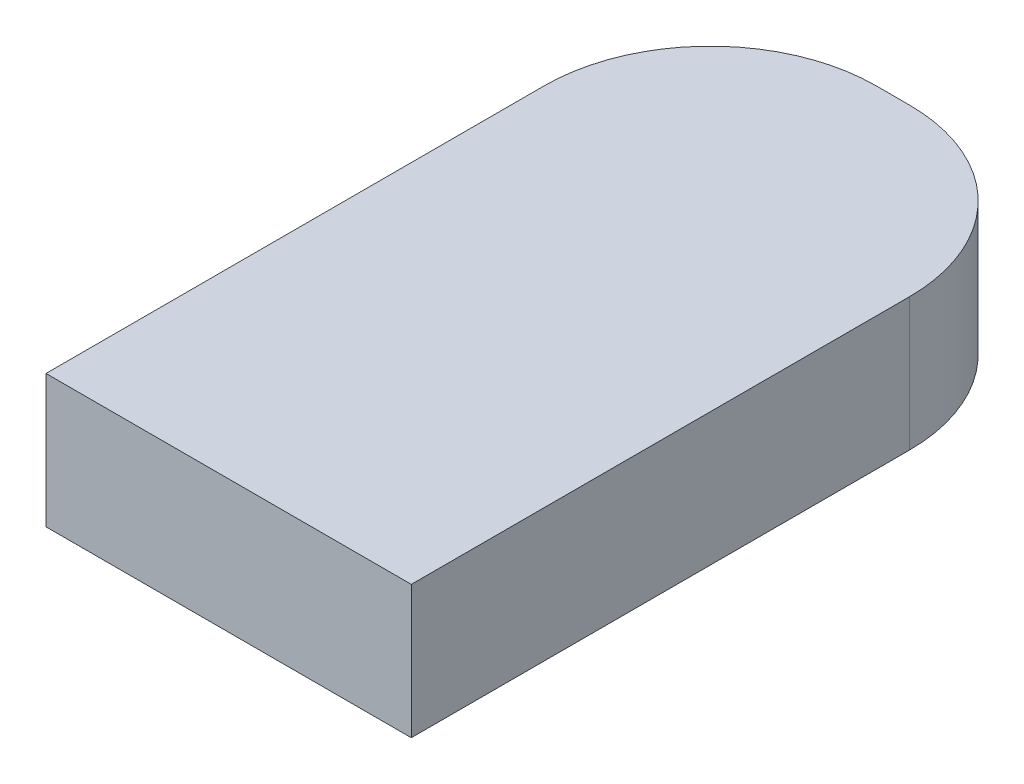
ISO-10303-21;
HEADER;
FILE_DESCRIPTION(('STEP AP214'),'2;1');
FILE_NAME('part.step','',(''),(''),'','','');
FILE_SCHEMA(('AUTOMOTIVE_DESIGN { 1 0 10303 214 1 1 1 1 }'));
ENDSEC;
DATA;
#1=APPLICATION_CONTEXT('core data for automotive mechanical design processes');
#2=APPLICATION_PROTOCOL_DEFINITION('international standard','automotive_design',2000,#1);
#3=PRODUCT_CONTEXT('',#1,'mechanical');
#4=PRODUCT('Part','Part','',(#3));
#5=PRODUCT_RELATED_PRODUCT_CATEGORY('part','',(#4));
#6=PRODUCT_DEFINITION_FORMATION('','',#4);
#7=PRODUCT_DEFINITION_CONTEXT('part definition',#1,'design');
#8=PRODUCT_DEFINITION('design','',#6,#7);
#9=PRODUCT_DEFINITION_SHAPE('','',#8);
#10=(LENGTH_UNIT() NAMED_UNIT(*) SI_UNIT(.MILLI.,.METRE.));
#11=(NAMED_UNIT(*) PLANE_ANGLE_UNIT() SI_UNIT($,.RADIAN.));
#12=(NAMED_UNIT(*) SI_UNIT($,.STERADIAN.) SOLID_ANGLE_UNIT());
#13=UNCERTAINTY_MEASURE_WITH_UNIT(LENGTH_MEASURE(1.E-05),#10,'distance_accuracy_value','');
#14=(GEOMETRIC_REPRESENTATION_CONTEXT(3) GLOBAL_UNCERTAINTY_ASSIGNED_CONTEXT((#13)) GLOBAL_UNIT_ASSIGNED_CONTEXT((#10,
#11,#12)) REPRESENTATION_CONTEXT('',''));
#15=CARTESIAN_POINT('',(0.,0.,0.));
#16=DIRECTION('',(0.,0.,1.));
#17=DIRECTION('',(1.,0.,0.));
#18=AXIS2_PLACEMENT_3D('',#15,#16,#17);
#19=CARTESIAN_POINT('',(0.,8.,0.));
#20=DIRECTION('',(1.,0.,0.));
#21=DIRECTION('',(0.,0.,-1.));
#22=AXIS2_PLACEMENT_3D('',#19,#20,#21);
#23=PLANE('',#22);
#24=DIRECTION('',(0.,0.,1.));
#25=VECTOR('',#24,1.);
#26=CARTESIAN_POINT('',(0.,0.,0.));
#27=LINE('',#26,#25);
#28=CARTESIAN_POINT('',(0.,0.,-29.9999999999999));
#29=VERTEX_POINT('',#28);
#30=CARTESIAN_POINT('',(0.,0.,0.));
#31=VERTEX_POINT('',#30);
#32=EDGE_CURVE('E117',#29,#31,#27,.T.);
#33=ORIENTED_EDGE('',*,*,#32,.T.);
#34=DIRECTION('',(0.,-1.,0.));
#35=VECTOR('',#34,1.);
#36=CARTESIAN_POINT('',(0.,8.,0.));
#37=LINE('',#36,#35);
#38=CARTESIAN_POINT('',(0.,8.,0.));
#39=VERTEX_POINT('',#38);
#40=EDGE_CURVE('E11',#39,#31,#37,.T.);
#41=ORIENTED_EDGE('',*,*,#40,.F.);
#42=DIRECTION('',(0.,0.,1.));
#43=VECTOR('',#42,1.);
#44=CARTESIAN_POINT('',(0.,8.,0.));
#45=LINE('',#44,#43);
#46=CARTESIAN_POINT('',(0.,8.,-29.9999999999999));
#47=VERTEX_POINT('',#46);
#48=EDGE_CURVE('E127',#47,#39,#45,.T.);
#49=ORIENTED_EDGE('',*,*,#48,.F.);
#50=DIRECTION('',(0.,-1.,0.));
#51=VECTOR('',#50,1.);
#52=CARTESIAN_POINT('',(0.,8.,-29.9999999999999));
#53=LINE('',#52,#51);
#54=EDGE_CURVE('E113',#47,#29,#53,.T.);
#55=ORIENTED_EDGE('',*,*,#54,.T.);
#56=EDGE_LOOP('',(#33,#41,#49,#55));
#57=FACE_BOUND('',#56,.T.);
#58=ADVANCED_FACE('F33',(#57),#23,.F.);
#59=CARTESIAN_POINT('',(0.,8.,0.));
#60=DIRECTION('',(0.,0.,-1.));
#61=DIRECTION('',(-1.,0.,0.));
#62=AXIS2_PLACEMENT_3D('',#59,#60,#61);
#63=PLANE('',#62);
#64=DIRECTION('',(1.,0.,0.));
#65=VECTOR('',#64,1.);
#66=CARTESIAN_POINT('',(0.,0.,0.));
#67=LINE('',#66,#65);
#68=CARTESIAN_POINT('',(22.,0.,0.));
#69=VERTEX_POINT('',#68);
#70=EDGE_CURVE('E120',#31,#69,#67,.T.);
#71=ORIENTED_EDGE('',*,*,#70,.T.);
#72=DIRECTION('',(0.,-1.,0.));
#73=VECTOR('',#72,1.);
#74=CARTESIAN_POINT('',(22.,8.,0.));
#75=LINE('',#74,#73);
#76=CARTESIAN_POINT('',(22.,8.,0.));
#77=VERTEX_POINT('',#76);
#78=EDGE_CURVE('E41',#77,#69,#75,.T.);
#79=ORIENTED_EDGE('',*,*,#78,.F.);
#80=DIRECTION('',(1.,0.,0.));
#81=VECTOR('',#80,1.);
#82=CARTESIAN_POINT('',(0.,8.,0.));
#83=LINE('',#82,#81);
#84=EDGE_CURVE('E86',#39,#77,#83,.T.);
#85=ORIENTED_EDGE('',*,*,#84,.F.);
#86=ORIENTED_EDGE('',*,*,#40,.T.);
#87=EDGE_LOOP('',(#71,#79,#85,#86));
#88=FACE_BOUND('',#87,.T.);
#89=ADVANCED_FACE('F151',(#88),#63,.F.);
#90=CARTESIAN_POINT('',(22.,8.,0.));
#91=DIRECTION('',(-1.,0.,0.));
#92=DIRECTION('',(0.,0.,1.));
#93=AXIS2_PLACEMENT_3D('',#90,#91,#92);
#94=PLANE('',#93);
#95=DIRECTION('',(0.,0.,-1.));
#96=VECTOR('',#95,1.);
#97=CARTESIAN_POINT('',(22.,0.,0.));
#98=LINE('',#97,#96);
#99=CARTESIAN_POINT('',(22.,0.,-29.9999999999999));
#100=VERTEX_POINT('',#99);
#101=EDGE_CURVE('E122',#69,#100,#98,.T.);
#102=ORIENTED_EDGE('',*,*,#101,.T.);
#103=DIRECTION('',(0.,-1.,0.));
#104=VECTOR('',#103,1.);
#105=CARTESIAN_POINT('',(22.,8.,-29.9999999999999));
#106=LINE('',#105,#104);
#107=CARTESIAN_POINT('',(22.,8.,-29.9999999999999));
#108=VERTEX_POINT('',#107);
#109=EDGE_CURVE('E108',#108,#100,#106,.T.);
#110=ORIENTED_EDGE('',*,*,#109,.F.);
#111=DIRECTION('',(0.,0.,-1.));
#112=VECTOR('',#111,1.);
#113=CARTESIAN_POINT('',(22.,8.,0.));
#114=LINE('',#113,#112);
#115=EDGE_CURVE('E99',#77,#108,#114,.T.);
#116=ORIENTED_EDGE('',*,*,#115,.F.);
#117=ORIENTED_EDGE('',*,*,#78,.T.);
#118=EDGE_LOOP('',(#102,#110,#116,#117));
#119=FACE_BOUND('',#118,.T.);
#120=ADVANCED_FACE('F133',(#119),#94,.F.);
#121=CARTESIAN_POINT('',(12.,8.,-30.));
#122=DIRECTION('',(0.,-1.,0.));
#123=DIRECTION('',(0.,0.,-1.));
#124=AXIS2_PLACEMENT_3D('',#121,#122,#123);
#125=CYLINDRICAL_SURFACE('',#124,10.);
#126=CARTESIAN_POINT('',(12.,0.,-30.));
#127=DIRECTION('',(0.,1.,0.));
#128=DIRECTION('',(0.,0.,-1.));
#129=AXIS2_PLACEMENT_3D('',#126,#127,#128);
#130=CIRCLE('',#129,10.);
#131=CARTESIAN_POINT('',(11.9999999999999,0.,-40.));
#132=VERTEX_POINT('',#131);
#133=EDGE_CURVE('E107',#100,#132,#130,.T.);
#134=ORIENTED_EDGE('',*,*,#133,.T.);
#135=DIRECTION('',(0.,-1.,0.));
#136=VECTOR('',#135,1.);
#137=CARTESIAN_POINT('',(11.9999999999999,8.,-40.));
#138=LINE('',#137,#136);
#139=CARTESIAN_POINT('',(11.9999999999999,8.,-40.));
#140=VERTEX_POINT('',#139);
#141=EDGE_CURVE('E104',#140,#132,#138,.T.);
#142=ORIENTED_EDGE('',*,*,#141,.F.);
#143=CARTESIAN_POINT('',(12.,8.,-30.));
#144=DIRECTION('',(0.,1.,0.));
#145=DIRECTION('',(0.,0.,-1.));
#146=AXIS2_PLACEMENT_3D('',#143,#144,#145);
#147=CIRCLE('',#146,10.);
#148=EDGE_CURVE('E93',#108,#140,#147,.T.);
#149=ORIENTED_EDGE('',*,*,#148,.F.);
#150=ORIENTED_EDGE('',*,*,#109,.T.);
#151=EDGE_LOOP('',(#134,#142,#149,#150));
#152=FACE_BOUND('',#151,.T.);
#153=ADVANCED_FACE('F105',(#152),#125,.T.);
#154=CARTESIAN_POINT('',(10.0000000000001,8.,-40.));
#155=DIRECTION('',(0.,0.,1.));
#156=DIRECTION('',(1.,0.,0.));
#157=AXIS2_PLACEMENT_3D('',#154,#155,#156);
#158=PLANE('',#157);
#159=DIRECTION('',(-1.,0.,0.));
#160=VECTOR('',#159,1.);
#161=CARTESIAN_POINT('',(10.0000000000001,0.,-40.));
#162=LINE('',#161,#160);
#163=CARTESIAN_POINT('',(10.0000000000001,0.,-40.));
#164=VERTEX_POINT('',#163);
#165=EDGE_CURVE('E72',#132,#164,#162,.T.);
#166=ORIENTED_EDGE('',*,*,#165,.T.);
#167=DIRECTION('',(0.,-1.,0.));
#168=VECTOR('',#167,1.);
#169=CARTESIAN_POINT('',(10.0000000000001,8.,-40.));
#170=LINE('',#169,#168);
#171=CARTESIAN_POINT('',(10.0000000000001,8.,-40.));
#172=VERTEX_POINT('',#171);
#173=EDGE_CURVE('E109',#172,#164,#170,.T.);
#174=ORIENTED_EDGE('',*,*,#173,.F.);
#175=DIRECTION('',(-1.,0.,0.));
#176=VECTOR('',#175,1.);
#177=CARTESIAN_POINT('',(10.0000000000001,8.,-40.));
#178=LINE('',#177,#176);
#179=EDGE_CURVE('E97',#140,#172,#178,.T.);
#180=ORIENTED_EDGE('',*,*,#179,.F.);
#181=ORIENTED_EDGE('',*,*,#141,.T.);
#182=EDGE_LOOP('',(#166,#174,#180,#181));
#183=FACE_BOUND('',#182,.T.);
#184=ADVANCED_FACE('F111',(#183),#158,.F.);
#185=CARTESIAN_POINT('',(10.,8.,-30.));
#186=DIRECTION('',(0.,-1.,0.));
#187=DIRECTION('',(0.,0.,-1.));
#188=AXIS2_PLACEMENT_3D('',#185,#186,#187);
#189=CYLINDRICAL_SURFACE('',#188,10.);
#190=CARTESIAN_POINT('',(10.,0.,-30.));
#191=DIRECTION('',(0.,1.,0.));
#192=DIRECTION('',(0.,0.,-1.));
#193=AXIS2_PLACEMENT_3D('',#190,#191,#192);
#194=CIRCLE('',#193,10.);
#195=EDGE_CURVE('E78',#164,#29,#194,.T.);
#196=ORIENTED_EDGE('',*,*,#195,.T.);
#197=ORIENTED_EDGE('',*,*,#54,.F.);
#198=CARTESIAN_POINT('',(10.,8.,-30.));
#199=DIRECTION('',(0.,1.,0.));
#200=DIRECTION('',(0.,0.,-1.));
#201=AXIS2_PLACEMENT_3D('',#198,#199,#200);
#202=CIRCLE('',#201,10.);
#203=EDGE_CURVE('E49',#172,#47,#202,.T.);
#204=ORIENTED_EDGE('',*,*,#203,.F.);
#205=ORIENTED_EDGE('',*,*,#173,.T.);
#206=EDGE_LOOP('',(#196,#197,#204,#205));
#207=FACE_BOUND('',#206,.T.);
#208=ADVANCED_FACE('F140',(#207),#189,.T.);
#209=CARTESIAN_POINT('',(10.,8.,-30.));
#210=DIRECTION('',(0.,-1.,0.));
#211=DIRECTION('',(0.,0.,-1.));
#212=AXIS2_PLACEMENT_3D('',#209,#210,#211);
#213=PLANE('',#212);
#214=ORIENTED_EDGE('',*,*,#48,.T.);
#215=ORIENTED_EDGE('',*,*,#84,.T.);
#216=ORIENTED_EDGE('',*,*,#115,.T.);
#217=ORIENTED_EDGE('',*,*,#148,.T.);
#218=ORIENTED_EDGE('',*,*,#179,.T.);
#219=ORIENTED_EDGE('',*,*,#203,.T.);
#220=EDGE_LOOP('',(#214,#215,#216,#217,#218,#219));
#221=FACE_BOUND('',#220,.T.);
#222=ADVANCED_FACE('F95',(#221),#213,.F.);
#223=CARTESIAN_POINT('',(10.,0.,-30.));
#224=DIRECTION('',(0.,-1.,0.));
#225=DIRECTION('',(0.,0.,-1.));
#226=AXIS2_PLACEMENT_3D('',#223,#224,#225);
#227=PLANE('',#226);
#228=ORIENTED_EDGE('',*,*,#32,.F.);
#229=ORIENTED_EDGE('',*,*,#195,.F.);
#230=ORIENTED_EDGE('',*,*,#165,.F.);
#231=ORIENTED_EDGE('',*,*,#133,.F.);
#232=ORIENTED_EDGE('',*,*,#101,.F.);
#233=ORIENTED_EDGE('',*,*,#70,.F.);
#234=EDGE_LOOP('',(#228,#229,#230,#231,#232,#233));
#235=FACE_BOUND('',#234,.T.);
#236=ADVANCED_FACE('F136',(#235),#227,.T.);
#237=CLOSED_SHELL('',(#58,#89,#120,#153,#184,#208,#222,#236));
#238=MANIFOLD_SOLID_BREP('B2',#237);
#239=ADVANCED_BREP_SHAPE_REPRESENTATION('',(#18,#238),#14);
#240=SHAPE_DEFINITION_REPRESENTATION(#9,#239);
ENDSEC;
END-ISO-10303-21;
